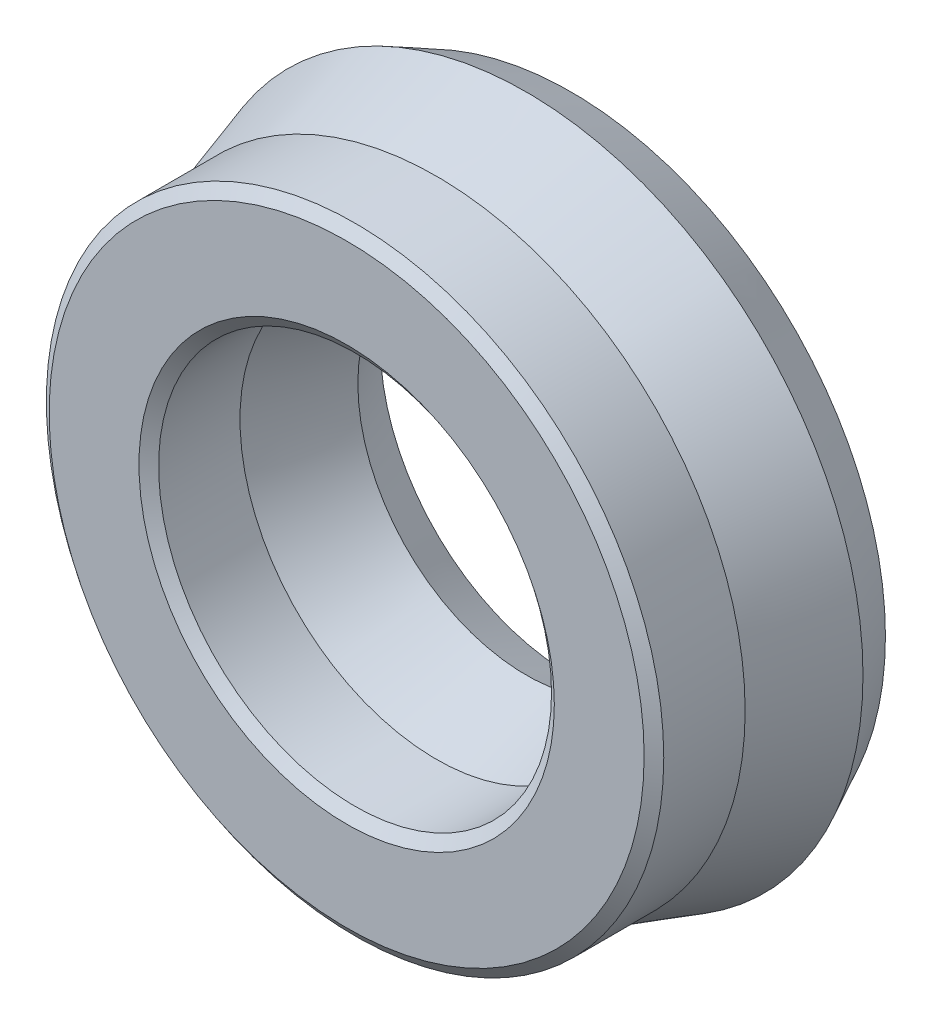
ISO-10303-21;
HEADER;
FILE_DESCRIPTION(('STEP AP214'),'2;1');
FILE_NAME('part.step','',(''),(''),'','','');
FILE_SCHEMA(('AUTOMOTIVE_DESIGN { 1 0 10303 214 1 1 1 1 }'));
ENDSEC;
DATA;
#1=APPLICATION_CONTEXT('core data for automotive mechanical design processes');
#2=APPLICATION_PROTOCOL_DEFINITION('international standard','automotive_design',2000,#1);
#3=PRODUCT_CONTEXT('',#1,'mechanical');
#4=PRODUCT('Part','Part','',(#3));
#5=PRODUCT_RELATED_PRODUCT_CATEGORY('part','',(#4));
#6=PRODUCT_DEFINITION_FORMATION('','',#4);
#7=PRODUCT_DEFINITION_CONTEXT('part definition',#1,'design');
#8=PRODUCT_DEFINITION('design','',#6,#7);
#9=PRODUCT_DEFINITION_SHAPE('','',#8);
#10=(LENGTH_UNIT() NAMED_UNIT(*) SI_UNIT(.MILLI.,.METRE.));
#11=(NAMED_UNIT(*) PLANE_ANGLE_UNIT() SI_UNIT($,.RADIAN.));
#12=(NAMED_UNIT(*) SI_UNIT($,.STERADIAN.) SOLID_ANGLE_UNIT());
#13=UNCERTAINTY_MEASURE_WITH_UNIT(LENGTH_MEASURE(1.E-05),#10,'distance_accuracy_value','');
#14=(GEOMETRIC_REPRESENTATION_CONTEXT(3) GLOBAL_UNCERTAINTY_ASSIGNED_CONTEXT((#13)) GLOBAL_UNIT_ASSIGNED_CONTEXT((#10,
#11,#12)) REPRESENTATION_CONTEXT('',''));
#15=CARTESIAN_POINT('',(0.,0.,0.));
#16=DIRECTION('',(0.,0.,1.));
#17=DIRECTION('',(1.,0.,0.));
#18=AXIS2_PLACEMENT_3D('',#15,#16,#17);
#19=CARTESIAN_POINT('',(0.,4.95542678472724,-0.0246883034922991));
#20=DIRECTION('',(0.,0.,-1.));
#21=DIRECTION('',(-1.,0.,0.));
#22=AXIS2_PLACEMENT_3D('',#19,#20,#21);
#23=CONICAL_SURFACE('',#22,3.4,0.463281215384184);
#24=CARTESIAN_POINT('',(0.,4.95542678472724,0.775458200253359));
#25=DIRECTION('',(0.,0.,1.));
#26=DIRECTION('',(1.,0.,0.));
#27=AXIS2_PLACEMENT_3D('',#24,#25,#26);
#28=CIRCLE('',#27,3.00029314173559);
#29=CARTESIAN_POINT('',(3.00029314173559,4.95542678472724,0.775458200253359));
#30=VERTEX_POINT('',#29);
#31=EDGE_CURVE('E10',#30,#30,#28,.T.);
#32=ORIENTED_EDGE('',*,*,#31,.T.);
#33=EDGE_LOOP('',(#32));
#34=FACE_BOUND('',#33,.T.);
#35=CARTESIAN_POINT('',(0.,4.95542678472724,-0.0246883034922991));
#36=DIRECTION('',(0.,0.,1.));
#37=DIRECTION('',(1.,0.,0.));
#38=AXIS2_PLACEMENT_3D('',#35,#36,#37);
#39=CIRCLE('',#38,3.4);
#40=CARTESIAN_POINT('',(3.4,4.95542678472724,-0.0246883034922991));
#41=VERTEX_POINT('',#40);
#42=EDGE_CURVE('E87',#41,#41,#39,.T.);
#43=ORIENTED_EDGE('',*,*,#42,.F.);
#44=EDGE_LOOP('',(#43));
#45=FACE_BOUND('',#44,.T.);
#46=ADVANCED_FACE('F41',(#34,#45),#23,.F.);
#47=CARTESIAN_POINT('',(0.,4.95542678472724,0.775458200253359));
#48=DIRECTION('',(0.,0.,1.));
#49=DIRECTION('',(1.,0.,0.));
#50=AXIS2_PLACEMENT_3D('',#47,#48,#49);
#51=CONICAL_SURFACE('',#50,3.00029314173559,0.302960987723613);
#52=CARTESIAN_POINT('',(0.,4.95542678472724,2.3753116965077));
#53=DIRECTION('',(0.,0.,1.));
#54=DIRECTION('',(1.,0.,0.));
#55=AXIS2_PLACEMENT_3D('',#52,#53,#54);
#56=CIRCLE('',#55,3.50038103486036);
#57=CARTESIAN_POINT('',(3.50038103486036,4.95542678472724,2.3753116965077));
#58=VERTEX_POINT('',#57);
#59=EDGE_CURVE('E50',#58,#58,#56,.T.);
#60=ORIENTED_EDGE('',*,*,#59,.T.);
#61=EDGE_LOOP('',(#60));
#62=FACE_BOUND('',#61,.T.);
#63=ORIENTED_EDGE('',*,*,#31,.F.);
#64=EDGE_LOOP('',(#63));
#65=FACE_BOUND('',#64,.T.);
#66=ADVANCED_FACE('F92',(#62,#65),#51,.F.);
#67=CARTESIAN_POINT('',(0.,4.95542678472724,17.3133842557531));
#68=DIRECTION('',(0.,0.,1.));
#69=DIRECTION('',(1.,0.,0.));
#70=AXIS2_PLACEMENT_3D('',#67,#68,#69);
#71=CYLINDRICAL_SURFACE('',#70,3.50038103486036);
#72=CARTESIAN_POINT('',(0.,4.95542678472724,3.8253116965077));
#73=DIRECTION('',(0.,0.,1.));
#74=DIRECTION('',(1.,0.,0.));
#75=AXIS2_PLACEMENT_3D('',#72,#73,#74);
#76=CIRCLE('',#75,3.50038103486036);
#77=CARTESIAN_POINT('',(3.50038103486036,4.95542678472724,3.8253116965077));
#78=VERTEX_POINT('',#77);
#79=EDGE_CURVE('E51',#78,#78,#76,.T.);
#80=ORIENTED_EDGE('',*,*,#79,.T.);
#81=EDGE_LOOP('',(#80));
#82=FACE_BOUND('',#81,.T.);
#83=ORIENTED_EDGE('',*,*,#59,.F.);
#84=EDGE_LOOP('',(#83));
#85=FACE_BOUND('',#84,.T.);
#86=ADVANCED_FACE('F97',(#82,#85),#71,.F.);
#87=CARTESIAN_POINT('',(0.,4.95542678472724,3.8253116965077));
#88=DIRECTION('',(0.,0.,1.));
#89=DIRECTION('',(1.,0.,0.));
#90=AXIS2_PLACEMENT_3D('',#87,#88,#89);
#91=CONICAL_SURFACE('',#90,3.50038103486036,0.927295218001616);
#92=CARTESIAN_POINT('',(0.,4.95542678472724,3.9753116965077));
#93=DIRECTION('',(0.,0.,1.));
#94=DIRECTION('',(1.,0.,0.));
#95=AXIS2_PLACEMENT_3D('',#92,#93,#94);
#96=CIRCLE('',#95,3.70038103486036);
#97=CARTESIAN_POINT('',(3.70038103486036,4.95542678472724,3.9753116965077));
#98=VERTEX_POINT('',#97);
#99=EDGE_CURVE('E54',#98,#98,#96,.T.);
#100=ORIENTED_EDGE('',*,*,#99,.T.);
#101=EDGE_LOOP('',(#100));
#102=FACE_BOUND('',#101,.T.);
#103=ORIENTED_EDGE('',*,*,#79,.F.);
#104=EDGE_LOOP('',(#103));
#105=FACE_BOUND('',#104,.T.);
#106=ADVANCED_FACE('F103',(#102,#105),#91,.F.);
#107=CARTESIAN_POINT('',(0.,-0.344954250133118,3.9753116965077));
#108=DIRECTION('',(0.,0.,1.));
#109=DIRECTION('',(1.,0.,0.));
#110=AXIS2_PLACEMENT_3D('',#107,#108,#109);
#111=PLANE('',#110);
#112=CARTESIAN_POINT('',(0.,4.95542678472724,3.9753116965077));
#113=DIRECTION('',(0.,0.,1.));
#114=DIRECTION('',(1.,0.,0.));
#115=AXIS2_PLACEMENT_3D('',#112,#113,#114);
#116=CIRCLE('',#115,5.30038103486036);
#117=CARTESIAN_POINT('',(5.30038103486036,4.95542678472724,3.9753116965077));
#118=VERTEX_POINT('',#117);
#119=EDGE_CURVE('E58',#118,#118,#116,.T.);
#120=ORIENTED_EDGE('',*,*,#119,.T.);
#121=EDGE_LOOP('',(#120));
#122=FACE_BOUND('',#121,.T.);
#123=ORIENTED_EDGE('',*,*,#99,.F.);
#124=EDGE_LOOP('',(#123));
#125=FACE_BOUND('',#124,.T.);
#126=ADVANCED_FACE('F109',(#122,#125),#111,.T.);
#127=CARTESIAN_POINT('',(0.,4.95542678472724,3.9753116965077));
#128=DIRECTION('',(0.,0.,-1.));
#129=DIRECTION('',(-1.,0.,0.));
#130=AXIS2_PLACEMENT_3D('',#127,#128,#129);
#131=CONICAL_SURFACE('',#130,5.30038103486036,0.927295218001614);
#132=CARTESIAN_POINT('',(0.,4.95542678472724,3.8253116965077));
#133=DIRECTION('',(0.,0.,1.));
#134=DIRECTION('',(1.,0.,0.));
#135=AXIS2_PLACEMENT_3D('',#132,#133,#134);
#136=CIRCLE('',#135,5.50038103486036);
#137=CARTESIAN_POINT('',(5.50038103486036,4.95542678472724,3.8253116965077));
#138=VERTEX_POINT('',#137);
#139=EDGE_CURVE('E65',#138,#138,#136,.T.);
#140=ORIENTED_EDGE('',*,*,#139,.T.);
#141=EDGE_LOOP('',(#140));
#142=FACE_BOUND('',#141,.T.);
#143=ORIENTED_EDGE('',*,*,#119,.F.);
#144=EDGE_LOOP('',(#143));
#145=FACE_BOUND('',#144,.T.);
#146=ADVANCED_FACE('F111',(#142,#145),#131,.T.);
#147=CARTESIAN_POINT('',(0.,4.95542678472724,17.3133842557531));
#148=DIRECTION('',(0.,0.,1.));
#149=DIRECTION('',(1.,0.,0.));
#150=AXIS2_PLACEMENT_3D('',#147,#148,#149);
#151=CYLINDRICAL_SURFACE('',#150,5.50038103486036);
#152=CARTESIAN_POINT('',(0.,4.95542678472724,2.3753116965077));
#153=DIRECTION('',(0.,0.,1.));
#154=DIRECTION('',(1.,0.,0.));
#155=AXIS2_PLACEMENT_3D('',#152,#153,#154);
#156=CIRCLE('',#155,5.50038103486036);
#157=CARTESIAN_POINT('',(5.50038103486036,4.95542678472724,2.3753116965077));
#158=VERTEX_POINT('',#157);
#159=EDGE_CURVE('E67',#158,#158,#156,.T.);
#160=ORIENTED_EDGE('',*,*,#159,.T.);
#161=EDGE_LOOP('',(#160));
#162=FACE_BOUND('',#161,.T.);
#163=ORIENTED_EDGE('',*,*,#139,.F.);
#164=EDGE_LOOP('',(#163));
#165=FACE_BOUND('',#164,.T.);
#166=ADVANCED_FACE('F120',(#162,#165),#151,.T.);
#167=CARTESIAN_POINT('',(0.,4.95542678472724,2.3753116965077));
#168=DIRECTION('',(0.,0.,-1.));
#169=DIRECTION('',(-1.,0.,0.));
#170=AXIS2_PLACEMENT_3D('',#167,#168,#169);
#171=CONICAL_SURFACE('',#170,5.50038103486036,0.302667894316486);
#172=CARTESIAN_POINT('',(0.,4.95542678472724,0.775311696507703));
#173=DIRECTION('',(0.,0.,1.));
#174=DIRECTION('',(1.,0.,0.));
#175=AXIS2_PLACEMENT_3D('',#172,#173,#174);
#176=CIRCLE('',#175,6.);
#177=CARTESIAN_POINT('',(6.,4.95542678472724,0.775311696507703));
#178=VERTEX_POINT('',#177);
#179=EDGE_CURVE('E66',#178,#178,#176,.T.);
#180=ORIENTED_EDGE('',*,*,#179,.T.);
#181=EDGE_LOOP('',(#180));
#182=FACE_BOUND('',#181,.T.);
#183=ORIENTED_EDGE('',*,*,#159,.F.);
#184=EDGE_LOOP('',(#183));
#185=FACE_BOUND('',#184,.T.);
#186=ADVANCED_FACE('F125',(#182,#185),#171,.T.);
#187=CARTESIAN_POINT('',(0.,4.95542678472724,0.775311696507703));
#188=DIRECTION('',(0.,0.,1.));
#189=DIRECTION('',(1.,0.,0.));
#190=AXIS2_PLACEMENT_3D('',#187,#188,#189);
#191=CONICAL_SURFACE('',#190,6.,0.463647609000805);
#192=CARTESIAN_POINT('',(0.,4.95542678472724,-0.0246883034922991));
#193=DIRECTION('',(0.,0.,1.));
#194=DIRECTION('',(1.,0.,0.));
#195=AXIS2_PLACEMENT_3D('',#192,#193,#194);
#196=CIRCLE('',#195,5.6);
#197=CARTESIAN_POINT('',(5.6,4.95542678472724,-0.0246883034922991));
#198=VERTEX_POINT('',#197);
#199=EDGE_CURVE('E75',#198,#198,#196,.T.);
#200=ORIENTED_EDGE('',*,*,#199,.T.);
#201=EDGE_LOOP('',(#200));
#202=FACE_BOUND('',#201,.T.);
#203=ORIENTED_EDGE('',*,*,#179,.F.);
#204=EDGE_LOOP('',(#203));
#205=FACE_BOUND('',#204,.T.);
#206=ADVANCED_FACE('F127',(#202,#205),#191,.T.);
#207=CARTESIAN_POINT('',(0.,-0.145335284993476,-0.0246883034922977));
#208=DIRECTION('',(0.,0.,-1.));
#209=DIRECTION('',(-1.,0.,0.));
#210=AXIS2_PLACEMENT_3D('',#207,#208,#209);
#211=PLANE('',#210);
#212=CARTESIAN_POINT('',(0.,4.95542678472724,-0.0246883034922991));
#213=DIRECTION('',(0.,0.,1.));
#214=DIRECTION('',(1.,0.,0.));
#215=AXIS2_PLACEMENT_3D('',#212,#213,#214);
#216=CIRCLE('',#215,5.10076206972071);
#217=CARTESIAN_POINT('',(5.10076206972071,4.95542678472724,-0.0246883034922991));
#218=VERTEX_POINT('',#217);
#219=EDGE_CURVE('E73',#218,#218,#216,.T.);
#220=ORIENTED_EDGE('',*,*,#219,.T.);
#221=EDGE_LOOP('',(#220));
#222=FACE_BOUND('',#221,.T.);
#223=ORIENTED_EDGE('',*,*,#199,.F.);
#224=EDGE_LOOP('',(#223));
#225=FACE_BOUND('',#224,.T.);
#226=ADVANCED_FACE('F128',(#222,#225),#211,.T.);
#227=CARTESIAN_POINT('',(0.,4.95542678472724,-0.0246883034922991));
#228=DIRECTION('',(0.,0.,-1.));
#229=DIRECTION('',(-1.,0.,0.));
#230=AXIS2_PLACEMENT_3D('',#227,#228,#229);
#231=CONICAL_SURFACE('',#230,5.10076206972071,0.322885911618955);
#232=CARTESIAN_POINT('',(0.,4.95542678472724,1.34132544107074));
#233=DIRECTION('',(0.,0.,1.));
#234=DIRECTION('',(1.,0.,0.));
#235=AXIS2_PLACEMENT_3D('',#232,#233,#234);
#236=CIRCLE('',#235,4.64370026441442);
#237=CARTESIAN_POINT('',(4.64370026441442,4.95542678472724,1.34132544107074));
#238=VERTEX_POINT('',#237);
#239=EDGE_CURVE('E80',#238,#238,#236,.T.);
#240=ORIENTED_EDGE('',*,*,#239,.T.);
#241=EDGE_LOOP('',(#240));
#242=FACE_BOUND('',#241,.T.);
#243=ORIENTED_EDGE('',*,*,#219,.F.);
#244=EDGE_LOOP('',(#243));
#245=FACE_BOUND('',#244,.T.);
#246=ADVANCED_FACE('F133',(#242,#245),#231,.F.);
#247=CARTESIAN_POINT('',(0.,4.95542678472724,1.28023336070944));
#248=DIRECTION('',(0.,0.,1.));
#249=DIRECTION('',(1.,0.,0.));
#250=AXIS2_PLACEMENT_3D('',#247,#248,#249);
#251=TOROIDAL_SURFACE('',#250,4.50038103486036,0.155796803057189);
#252=CARTESIAN_POINT('',(0.,4.95542678472724,1.34132544107074));
#253=DIRECTION('',(0.,0.,1.));
#254=DIRECTION('',(1.,0.,0.));
#255=AXIS2_PLACEMENT_3D('',#252,#253,#254);
#256=CIRCLE('',#255,4.3570618053063);
#257=CARTESIAN_POINT('',(4.3570618053063,4.95542678472724,1.34132544107074));
#258=VERTEX_POINT('',#257);
#259=EDGE_CURVE('E82',#258,#258,#256,.T.);
#260=ORIENTED_EDGE('',*,*,#259,.T.);
#261=EDGE_LOOP('',(#260));
#262=FACE_BOUND('',#261,.T.);
#263=ORIENTED_EDGE('',*,*,#239,.F.);
#264=EDGE_LOOP('',(#263));
#265=FACE_BOUND('',#264,.T.);
#266=ADVANCED_FACE('F139',(#262,#265),#251,.F.);
#267=CARTESIAN_POINT('',(0.,4.95542678472724,1.34132544107074));
#268=DIRECTION('',(0.,0.,1.));
#269=DIRECTION('',(1.,0.,0.));
#270=AXIS2_PLACEMENT_3D('',#267,#268,#269);
#271=CONICAL_SURFACE('',#270,4.3570618053063,0.322885911618955);
#272=CARTESIAN_POINT('',(0.,4.95542678472724,-0.0246883034922991));
#273=DIRECTION('',(0.,0.,1.));
#274=DIRECTION('',(1.,0.,0.));
#275=AXIS2_PLACEMENT_3D('',#272,#273,#274);
#276=CIRCLE('',#275,3.9);
#277=CARTESIAN_POINT('',(3.9,4.95542678472724,-0.0246883034922991));
#278=VERTEX_POINT('',#277);
#279=EDGE_CURVE('E81',#278,#278,#276,.T.);
#280=ORIENTED_EDGE('',*,*,#279,.T.);
#281=EDGE_LOOP('',(#280));
#282=FACE_BOUND('',#281,.T.);
#283=ORIENTED_EDGE('',*,*,#259,.F.);
#284=EDGE_LOOP('',(#283));
#285=FACE_BOUND('',#284,.T.);
#286=ADVANCED_FACE('F142',(#282,#285),#271,.T.);
#287=CARTESIAN_POINT('',(0.,1.55542678472724,-0.0246883034922977));
#288=DIRECTION('',(0.,0.,-1.));
#289=DIRECTION('',(-1.,0.,0.));
#290=AXIS2_PLACEMENT_3D('',#287,#288,#289);
#291=PLANE('',#290);
#292=ORIENTED_EDGE('',*,*,#42,.T.);
#293=EDGE_LOOP('',(#292));
#294=FACE_BOUND('',#293,.T.);
#295=ORIENTED_EDGE('',*,*,#279,.F.);
#296=EDGE_LOOP('',(#295));
#297=FACE_BOUND('',#296,.T.);
#298=ADVANCED_FACE('F93',(#294,#297),#291,.T.);
#299=CLOSED_SHELL('',(#46,#66,#86,#106,#126,#146,#166,#186,#206,#226,#246,#266,#286,#298));
#300=MANIFOLD_SOLID_BREP('B2',#299);
#301=ADVANCED_BREP_SHAPE_REPRESENTATION('',(#18,#300),#14);
#302=SHAPE_DEFINITION_REPRESENTATION(#9,#301);
ENDSEC;
END-ISO-10303-21;
